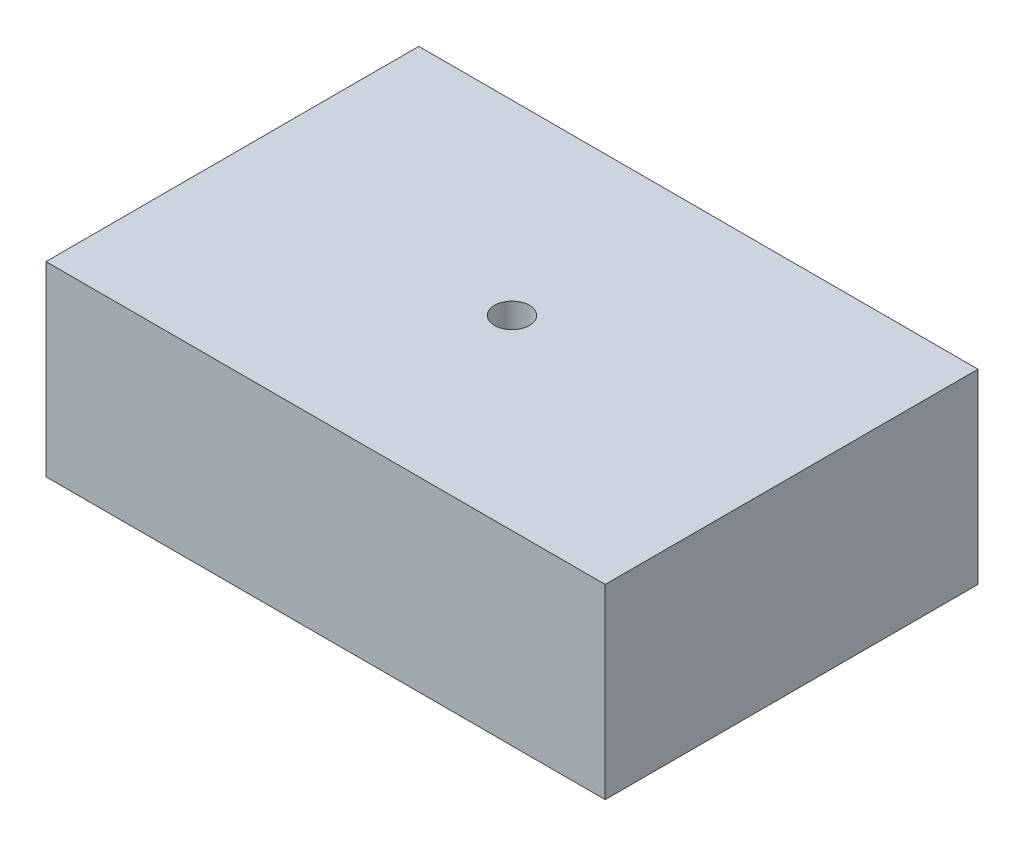
ISO-10303-21;
HEADER;
FILE_DESCRIPTION(('STEP AP214'),'2;1');
FILE_NAME('part.step','',(''),(''),'','','');
FILE_SCHEMA(('AUTOMOTIVE_DESIGN { 1 0 10303 214 1 1 1 1 }'));
ENDSEC;
DATA;
#1=APPLICATION_CONTEXT('core data for automotive mechanical design processes');
#2=APPLICATION_PROTOCOL_DEFINITION('international standard','automotive_design',2000,#1);
#3=PRODUCT_CONTEXT('',#1,'mechanical');
#4=PRODUCT('Part','Part','',(#3));
#5=PRODUCT_RELATED_PRODUCT_CATEGORY('part','',(#4));
#6=PRODUCT_DEFINITION_FORMATION('','',#4);
#7=PRODUCT_DEFINITION_CONTEXT('part definition',#1,'design');
#8=PRODUCT_DEFINITION('design','',#6,#7);
#9=PRODUCT_DEFINITION_SHAPE('','',#8);
#10=(LENGTH_UNIT() NAMED_UNIT(*) SI_UNIT(.MILLI.,.METRE.));
#11=(NAMED_UNIT(*) PLANE_ANGLE_UNIT() SI_UNIT($,.RADIAN.));
#12=(NAMED_UNIT(*) SI_UNIT($,.STERADIAN.) SOLID_ANGLE_UNIT());
#13=UNCERTAINTY_MEASURE_WITH_UNIT(LENGTH_MEASURE(1.E-05),#10,'distance_accuracy_value','');
#14=(GEOMETRIC_REPRESENTATION_CONTEXT(3) GLOBAL_UNCERTAINTY_ASSIGNED_CONTEXT((#13)) GLOBAL_UNIT_ASSIGNED_CONTEXT((#10,
#11,#12)) REPRESENTATION_CONTEXT('',''));
#15=CARTESIAN_POINT('',(0.,0.,0.));
#16=DIRECTION('',(0.,0.,1.));
#17=DIRECTION('',(1.,0.,0.));
#18=AXIS2_PLACEMENT_3D('',#15,#16,#17);
#19=CARTESIAN_POINT('',(0.,25.4,0.));
#20=DIRECTION('',(0.,1.,0.));
#21=DIRECTION('',(0.,0.,1.));
#22=AXIS2_PLACEMENT_3D('',#19,#20,#21);
#23=PLANE('',#22);
#24=DIRECTION('',(0.,0.,1.));
#25=VECTOR('',#24,1.);
#26=CARTESIAN_POINT('',(0.,25.4,0.));
#27=LINE('',#26,#25);
#28=CARTESIAN_POINT('',(0.,25.4,0.));
#29=VERTEX_POINT('',#28);
#30=CARTESIAN_POINT('',(0.,25.4,50.8));
#31=VERTEX_POINT('',#30);
#32=EDGE_CURVE('E92',#29,#31,#27,.T.);
#33=ORIENTED_EDGE('',*,*,#32,.T.);
#34=DIRECTION('',(1.,0.,0.));
#35=VECTOR('',#34,1.);
#36=CARTESIAN_POINT('',(0.,25.4,50.8));
#37=LINE('',#36,#35);
#38=CARTESIAN_POINT('',(76.2,25.4,50.8));
#39=VERTEX_POINT('',#38);
#40=EDGE_CURVE('E87',#31,#39,#37,.T.);
#41=ORIENTED_EDGE('',*,*,#40,.T.);
#42=DIRECTION('',(0.,0.,-1.));
#43=VECTOR('',#42,1.);
#44=CARTESIAN_POINT('',(76.2,25.4,0.));
#45=LINE('',#44,#43);
#46=CARTESIAN_POINT('',(76.2,25.4,0.));
#47=VERTEX_POINT('',#46);
#48=EDGE_CURVE('E90',#39,#47,#45,.T.);
#49=ORIENTED_EDGE('',*,*,#48,.T.);
#50=DIRECTION('',(-1.,0.,0.));
#51=VECTOR('',#50,1.);
#52=CARTESIAN_POINT('',(0.,25.4,0.));
#53=LINE('',#52,#51);
#54=EDGE_CURVE('E57',#47,#29,#53,.T.);
#55=ORIENTED_EDGE('',*,*,#54,.T.);
#56=EDGE_LOOP('',(#33,#41,#49,#55));
#57=FACE_BOUND('',#56,.T.);
#58=CARTESIAN_POINT('',(38.1,25.4,25.4));
#59=DIRECTION('',(0.,1.,0.));
#60=DIRECTION('',(0.,0.,1.));
#61=AXIS2_PLACEMENT_3D('',#58,#59,#60);
#62=CIRCLE('',#61,2.38125);
#63=CARTESIAN_POINT('',(38.1,25.4,27.78125));
#64=VERTEX_POINT('',#63);
#65=EDGE_CURVE('E112',#64,#64,#62,.T.);
#66=ORIENTED_EDGE('',*,*,#65,.F.);
#67=EDGE_LOOP('',(#66));
#68=FACE_BOUND('',#67,.T.);
#69=ADVANCED_FACE('F39',(#57,#68),#23,.T.);
#70=CARTESIAN_POINT('',(0.,0.,0.));
#71=DIRECTION('',(0.,1.,0.));
#72=DIRECTION('',(0.,0.,1.));
#73=AXIS2_PLACEMENT_3D('',#70,#71,#72);
#74=PLANE('',#73);
#75=DIRECTION('',(0.,0.,1.));
#76=VECTOR('',#75,1.);
#77=CARTESIAN_POINT('',(0.,0.,0.));
#78=LINE('',#77,#76);
#79=CARTESIAN_POINT('',(0.,0.,0.));
#80=VERTEX_POINT('',#79);
#81=CARTESIAN_POINT('',(0.,0.,50.8));
#82=VERTEX_POINT('',#81);
#83=EDGE_CURVE('E108',#80,#82,#78,.T.);
#84=ORIENTED_EDGE('',*,*,#83,.F.);
#85=DIRECTION('',(-1.,0.,0.));
#86=VECTOR('',#85,1.);
#87=CARTESIAN_POINT('',(0.,0.,0.));
#88=LINE('',#87,#86);
#89=CARTESIAN_POINT('',(76.2,0.,0.));
#90=VERTEX_POINT('',#89);
#91=EDGE_CURVE('E80',#90,#80,#88,.T.);
#92=ORIENTED_EDGE('',*,*,#91,.F.);
#93=DIRECTION('',(0.,0.,-1.));
#94=VECTOR('',#93,1.);
#95=CARTESIAN_POINT('',(76.2,0.,0.));
#96=LINE('',#95,#94);
#97=CARTESIAN_POINT('',(76.2,0.,50.8));
#98=VERTEX_POINT('',#97);
#99=EDGE_CURVE('E74',#98,#90,#96,.T.);
#100=ORIENTED_EDGE('',*,*,#99,.F.);
#101=DIRECTION('',(1.,0.,0.));
#102=VECTOR('',#101,1.);
#103=CARTESIAN_POINT('',(0.,0.,50.8));
#104=LINE('',#103,#102);
#105=EDGE_CURVE('E97',#82,#98,#104,.T.);
#106=ORIENTED_EDGE('',*,*,#105,.F.);
#107=EDGE_LOOP('',(#84,#92,#100,#106));
#108=FACE_BOUND('',#107,.T.);
#109=CARTESIAN_POINT('',(38.1,0.,25.4));
#110=DIRECTION('',(0.,1.,0.));
#111=DIRECTION('',(0.,0.,1.));
#112=AXIS2_PLACEMENT_3D('',#109,#110,#111);
#113=CIRCLE('',#112,2.38125);
#114=CARTESIAN_POINT('',(38.1,0.,27.78125));
#115=VERTEX_POINT('',#114);
#116=EDGE_CURVE('E130',#115,#115,#113,.T.);
#117=ORIENTED_EDGE('',*,*,#116,.T.);
#118=EDGE_LOOP('',(#117));
#119=FACE_BOUND('',#118,.T.);
#120=ADVANCED_FACE('F125',(#108,#119),#74,.F.);
#121=CARTESIAN_POINT('',(0.,25.4,0.));
#122=DIRECTION('',(1.,0.,0.));
#123=DIRECTION('',(0.,0.,-1.));
#124=AXIS2_PLACEMENT_3D('',#121,#122,#123);
#125=PLANE('',#124);
#126=ORIENTED_EDGE('',*,*,#83,.T.);
#127=DIRECTION('',(0.,-1.,0.));
#128=VECTOR('',#127,1.);
#129=CARTESIAN_POINT('',(0.,25.4,50.8));
#130=LINE('',#129,#128);
#131=EDGE_CURVE('E11',#31,#82,#130,.T.);
#132=ORIENTED_EDGE('',*,*,#131,.F.);
#133=ORIENTED_EDGE('',*,*,#32,.F.);
#134=DIRECTION('',(0.,-1.,0.));
#135=VECTOR('',#134,1.);
#136=CARTESIAN_POINT('',(0.,25.4,0.));
#137=LINE('',#136,#135);
#138=EDGE_CURVE('E104',#29,#80,#137,.T.);
#139=ORIENTED_EDGE('',*,*,#138,.T.);
#140=EDGE_LOOP('',(#126,#132,#133,#139));
#141=FACE_BOUND('',#140,.T.);
#142=ADVANCED_FACE('F41',(#141),#125,.F.);
#143=CARTESIAN_POINT('',(0.,25.4,50.8));
#144=DIRECTION('',(0.,0.,-1.));
#145=DIRECTION('',(-1.,0.,0.));
#146=AXIS2_PLACEMENT_3D('',#143,#144,#145);
#147=PLANE('',#146);
#148=ORIENTED_EDGE('',*,*,#105,.T.);
#149=DIRECTION('',(0.,-1.,0.));
#150=VECTOR('',#149,1.);
#151=CARTESIAN_POINT('',(76.2,25.4,50.8));
#152=LINE('',#151,#150);
#153=EDGE_CURVE('E49',#39,#98,#152,.T.);
#154=ORIENTED_EDGE('',*,*,#153,.F.);
#155=ORIENTED_EDGE('',*,*,#40,.F.);
#156=ORIENTED_EDGE('',*,*,#131,.T.);
#157=EDGE_LOOP('',(#148,#154,#155,#156));
#158=FACE_BOUND('',#157,.T.);
#159=ADVANCED_FACE('F96',(#158),#147,.F.);
#160=CARTESIAN_POINT('',(76.2,25.4,0.));
#161=DIRECTION('',(-1.,0.,0.));
#162=DIRECTION('',(0.,0.,1.));
#163=AXIS2_PLACEMENT_3D('',#160,#161,#162);
#164=PLANE('',#163);
#165=ORIENTED_EDGE('',*,*,#99,.T.);
#166=DIRECTION('',(0.,-1.,0.));
#167=VECTOR('',#166,1.);
#168=CARTESIAN_POINT('',(76.2,25.4,0.));
#169=LINE('',#168,#167);
#170=EDGE_CURVE('E99',#47,#90,#169,.T.);
#171=ORIENTED_EDGE('',*,*,#170,.F.);
#172=ORIENTED_EDGE('',*,*,#48,.F.);
#173=ORIENTED_EDGE('',*,*,#153,.T.);
#174=EDGE_LOOP('',(#165,#171,#172,#173));
#175=FACE_BOUND('',#174,.T.);
#176=ADVANCED_FACE('F100',(#175),#164,.F.);
#177=CARTESIAN_POINT('',(0.,25.4,0.));
#178=DIRECTION('',(0.,0.,1.));
#179=DIRECTION('',(1.,0.,0.));
#180=AXIS2_PLACEMENT_3D('',#177,#178,#179);
#181=PLANE('',#180);
#182=ORIENTED_EDGE('',*,*,#91,.T.);
#183=ORIENTED_EDGE('',*,*,#138,.F.);
#184=ORIENTED_EDGE('',*,*,#54,.F.);
#185=ORIENTED_EDGE('',*,*,#170,.T.);
#186=EDGE_LOOP('',(#182,#183,#184,#185));
#187=FACE_BOUND('',#186,.T.);
#188=ADVANCED_FACE('F122',(#187),#181,.F.);
#189=CARTESIAN_POINT('',(38.1,25.4,25.4));
#190=DIRECTION('',(0.,-1.,0.));
#191=DIRECTION('',(0.,0.,-1.));
#192=AXIS2_PLACEMENT_3D('',#189,#190,#191);
#193=CYLINDRICAL_SURFACE('',#192,2.38125);
#194=ORIENTED_EDGE('',*,*,#65,.T.);
#195=EDGE_LOOP('',(#194));
#196=FACE_BOUND('',#195,.T.);
#197=ORIENTED_EDGE('',*,*,#116,.F.);
#198=EDGE_LOOP('',(#197));
#199=FACE_BOUND('',#198,.T.);
#200=ADVANCED_FACE('F138',(#196,#199),#193,.F.);
#201=CLOSED_SHELL('',(#69,#120,#142,#159,#176,#188,#200));
#202=MANIFOLD_SOLID_BREP('B2',#201);
#203=ADVANCED_BREP_SHAPE_REPRESENTATION('',(#18,#202),#14);
#204=SHAPE_DEFINITION_REPRESENTATION(#9,#203);
ENDSEC;
END-ISO-10303-21;
